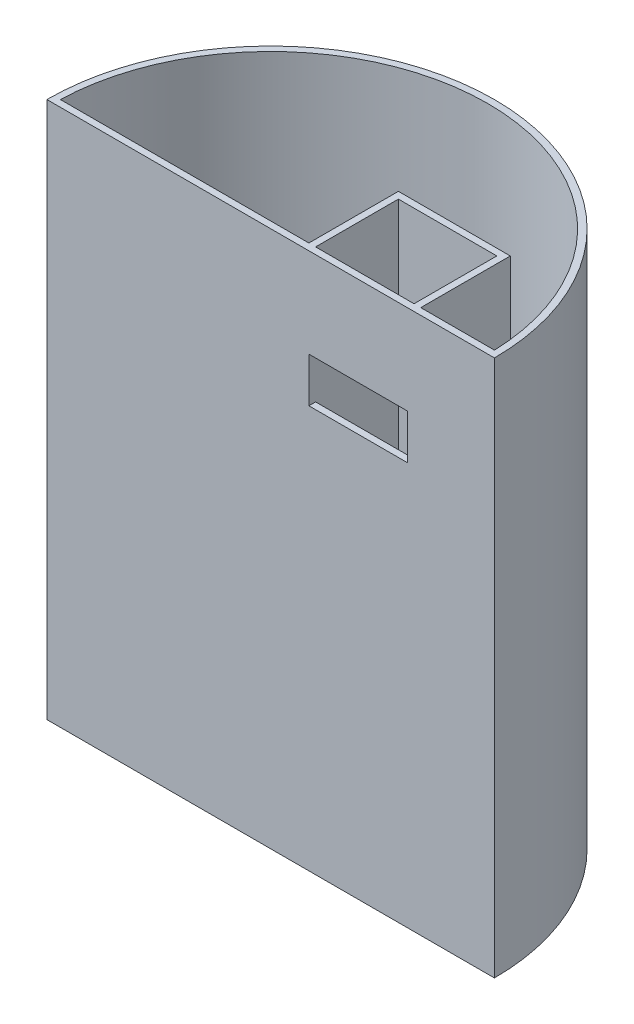
ISO-10303-21;
HEADER;
FILE_DESCRIPTION(('STEP AP214'),'2;1');
FILE_NAME('part.step','',(''),(''),'','','');
FILE_SCHEMA(('AUTOMOTIVE_DESIGN { 1 0 10303 214 1 1 1 1 }'));
ENDSEC;
DATA;
#1=APPLICATION_CONTEXT('core data for automotive mechanical design processes');
#2=APPLICATION_PROTOCOL_DEFINITION('international standard','automotive_design',2000,#1);
#3=PRODUCT_CONTEXT('',#1,'mechanical');
#4=PRODUCT('Part','Part','',(#3));
#5=PRODUCT_RELATED_PRODUCT_CATEGORY('part','',(#4));
#6=PRODUCT_DEFINITION_FORMATION('','',#4);
#7=PRODUCT_DEFINITION_CONTEXT('part definition',#1,'design');
#8=PRODUCT_DEFINITION('design','',#6,#7);
#9=PRODUCT_DEFINITION_SHAPE('','',#8);
#10=(LENGTH_UNIT() NAMED_UNIT(*) SI_UNIT(.MILLI.,.METRE.));
#11=(NAMED_UNIT(*) PLANE_ANGLE_UNIT() SI_UNIT($,.RADIAN.));
#12=(NAMED_UNIT(*) SI_UNIT($,.STERADIAN.) SOLID_ANGLE_UNIT());
#13=UNCERTAINTY_MEASURE_WITH_UNIT(LENGTH_MEASURE(1.E-05),#10,'distance_accuracy_value','');
#14=(GEOMETRIC_REPRESENTATION_CONTEXT(3) GLOBAL_UNCERTAINTY_ASSIGNED_CONTEXT((#13)) GLOBAL_UNIT_ASSIGNED_CONTEXT((#10,
#11,#12)) REPRESENTATION_CONTEXT('',''));
#15=CARTESIAN_POINT('',(0.,0.,0.));
#16=DIRECTION('',(0.,0.,1.));
#17=DIRECTION('',(1.,0.,0.));
#18=AXIS2_PLACEMENT_3D('',#15,#16,#17);
#19=CARTESIAN_POINT('',(161.082312278561,57.,-2.9999999999859));
#20=DIRECTION('',(0.,0.,1.));
#21=DIRECTION('',(1.,0.,0.));
#22=AXIS2_PLACEMENT_3D('',#19,#20,#21);
#23=PLANE('',#22);
#24=DIRECTION('',(0.,1.,0.));
#25=VECTOR('',#24,1.);
#26=CARTESIAN_POINT('',(161.082312278561,57.,-2.9999999999859));
#27=LINE('',#26,#25);
#28=CARTESIAN_POINT('',(161.082312278561,200.,-3.));
#29=VERTEX_POINT('',#28);
#30=CARTESIAN_POINT('',(161.082312278561,240.,-2.9999999999859));
#31=VERTEX_POINT('',#30);
#32=EDGE_CURVE('E190',#29,#31,#27,.T.);
#33=ORIENTED_EDGE('',*,*,#32,.F.);
#34=DIRECTION('',(-1.,0.,0.));
#35=VECTOR('',#34,1.);
#36=CARTESIAN_POINT('',(117.082312278561,200.,-3.));
#37=LINE('',#36,#35);
#38=CARTESIAN_POINT('',(117.082312278561,200.,-3.));
#39=VERTEX_POINT('',#38);
#40=EDGE_CURVE('E163',#29,#39,#37,.T.);
#41=ORIENTED_EDGE('',*,*,#40,.T.);
#42=DIRECTION('',(0.,1.,0.));
#43=VECTOR('',#42,1.);
#44=CARTESIAN_POINT('',(117.082312278561,57.,-2.9999999999859));
#45=LINE('',#44,#43);
#46=CARTESIAN_POINT('',(117.082312278561,240.,-2.9999999999859));
#47=VERTEX_POINT('',#46);
#48=EDGE_CURVE('E176',#39,#47,#45,.T.);
#49=ORIENTED_EDGE('',*,*,#48,.T.);
#50=DIRECTION('',(1.,0.,0.));
#51=VECTOR('',#50,1.);
#52=CARTESIAN_POINT('',(161.082312278561,240.,-2.9999999999859));
#53=LINE('',#52,#51);
#54=EDGE_CURVE('E266',#47,#31,#53,.T.);
#55=ORIENTED_EDGE('',*,*,#54,.T.);
#56=EDGE_LOOP('',(#33,#41,#49,#55));
#57=FACE_BOUND('',#56,.T.);
#58=ADVANCED_FACE('F42',(#57),#23,.F.);
#59=CARTESIAN_POINT('',(-399900.,0.,-2.9999999999859));
#60=DIRECTION('',(0.,0.,-1.));
#61=DIRECTION('',(-1.,0.,0.));
#62=AXIS2_PLACEMENT_3D('',#59,#60,#61);
#63=PLANE('',#62);
#64=DIRECTION('',(-1.,0.,0.));
#65=VECTOR('',#64,1.);
#66=CARTESIAN_POINT('',(164.082312278561,54.,-2.9999999999859));
#67=LINE('',#66,#65);
#68=CARTESIAN_POINT('',(164.082312278561,54.,-2.9999999999859));
#69=VERTEX_POINT('',#68);
#70=CARTESIAN_POINT('',(114.082312278561,54.,-2.9999999999859));
#71=VERTEX_POINT('',#70);
#72=EDGE_CURVE('E178',#69,#71,#67,.T.);
#73=ORIENTED_EDGE('',*,*,#72,.F.);
#74=DIRECTION('',(0.,-1.,0.));
#75=VECTOR('',#74,1.);
#76=CARTESIAN_POINT('',(164.082312278561,240.,-2.9999999999859));
#77=LINE('',#76,#75);
#78=CARTESIAN_POINT('',(164.082312278561,240.,-2.9999999999859));
#79=VERTEX_POINT('',#78);
#80=EDGE_CURVE('E175',#79,#69,#77,.T.);
#81=ORIENTED_EDGE('',*,*,#80,.F.);
#82=DIRECTION('',(-1.,0.,0.));
#83=VECTOR('',#82,1.);
#84=CARTESIAN_POINT('',(-399900.,240.,-2.9999999999859));
#85=LINE('',#84,#83);
#86=CARTESIAN_POINT('',(197.000000000003,240.,-2.9999999999859));
#87=VERTEX_POINT('',#86);
#88=EDGE_CURVE('E222',#87,#79,#85,.T.);
#89=ORIENTED_EDGE('',*,*,#88,.F.);
#90=DIRECTION('',(0.,1.,0.));
#91=VECTOR('',#90,1.);
#92=CARTESIAN_POINT('',(197.000000000003,0.,-2.9999999999859));
#93=LINE('',#92,#91);
#94=CARTESIAN_POINT('',(197.000000000003,3.,-2.9999999999859));
#95=VERTEX_POINT('',#94);
#96=EDGE_CURVE('E226',#95,#87,#93,.T.);
#97=ORIENTED_EDGE('',*,*,#96,.F.);
#98=DIRECTION('',(1.,0.,0.));
#99=VECTOR('',#98,1.);
#100=CARTESIAN_POINT('',(2.9999999999859,3.,-2.9999999999859));
#101=LINE('',#100,#99);
#102=CARTESIAN_POINT('',(2.9999999999859,3.,-2.9999999999859));
#103=VERTEX_POINT('',#102);
#104=EDGE_CURVE('E216',#103,#95,#101,.T.);
#105=ORIENTED_EDGE('',*,*,#104,.F.);
#106=DIRECTION('',(0.,1.,0.));
#107=VECTOR('',#106,1.);
#108=CARTESIAN_POINT('',(2.9999999999859,0.,-2.9999999999859));
#109=LINE('',#108,#107);
#110=CARTESIAN_POINT('',(2.9999999999859,240.,-2.9999999999859));
#111=VERTEX_POINT('',#110);
#112=EDGE_CURVE('E225',#103,#111,#109,.T.);
#113=ORIENTED_EDGE('',*,*,#112,.T.);
#114=CARTESIAN_POINT('',(114.082312278583,240.,-2.9999999999859));
#115=VERTEX_POINT('',#114);
#116=EDGE_CURVE('E221',#115,#111,#85,.T.);
#117=ORIENTED_EDGE('',*,*,#116,.F.);
#118=DIRECTION('',(0.,1.,0.));
#119=VECTOR('',#118,1.);
#120=CARTESIAN_POINT('',(114.082312278561,54.,-2.9999999999859));
#121=LINE('',#120,#119);
#122=EDGE_CURVE('E195',#71,#115,#121,.T.);
#123=ORIENTED_EDGE('',*,*,#122,.F.);
#124=EDGE_LOOP('',(#73,#81,#89,#97,#105,#113,#117,#123));
#125=FACE_BOUND('',#124,.T.);
#126=ADVANCED_FACE('F337',(#125),#63,.T.);
#127=CARTESIAN_POINT('',(100.,0.,0.0686658968005577));
#128=DIRECTION('',(0.,1.,0.));
#129=DIRECTION('',(0.,0.,1.));
#130=AXIS2_PLACEMENT_3D('',#127,#128,#129);
#131=CYLINDRICAL_SURFACE('',#130,97.0485276054521);
#132=CARTESIAN_POINT('',(99.9999999999943,3.,0.0686658968005937));
#133=DIRECTION('',(0.,1.,0.));
#134=DIRECTION('',(0.,0.,-1.));
#135=AXIS2_PLACEMENT_3D('',#132,#133,#134);
#136=CIRCLE('',#135,97.04852760546);
#137=EDGE_CURVE('E214',#95,#103,#136,.T.);
#138=ORIENTED_EDGE('',*,*,#137,.F.);
#139=ORIENTED_EDGE('',*,*,#96,.T.);
#140=CARTESIAN_POINT('',(100.,240.,0.0686658968005577));
#141=DIRECTION('',(0.,1.,0.));
#142=DIRECTION('',(0.,0.,1.));
#143=AXIS2_PLACEMENT_3D('',#140,#141,#142);
#144=CIRCLE('',#143,97.0485276054521);
#145=EDGE_CURVE('E218',#87,#111,#144,.T.);
#146=ORIENTED_EDGE('',*,*,#145,.T.);
#147=ORIENTED_EDGE('',*,*,#112,.F.);
#148=EDGE_LOOP('',(#138,#139,#146,#147));
#149=FACE_BOUND('',#148,.T.);
#150=ADVANCED_FACE('F341',(#149),#131,.F.);
#151=CARTESIAN_POINT('',(100.,240.,0.));
#152=DIRECTION('',(0.,-1.,0.));
#153=DIRECTION('',(0.,0.,-1.));
#154=AXIS2_PLACEMENT_3D('',#151,#152,#153);
#155=CYLINDRICAL_SURFACE('',#154,100.);
#156=CARTESIAN_POINT('',(100.,0.,0.));
#157=DIRECTION('',(0.,1.,0.));
#158=DIRECTION('',(0.,0.,-1.));
#159=AXIS2_PLACEMENT_3D('',#156,#157,#158);
#160=CIRCLE('',#159,100.);
#161=CARTESIAN_POINT('',(200.,0.,0.));
#162=VERTEX_POINT('',#161);
#163=CARTESIAN_POINT('',(0.,0.,0.));
#164=VERTEX_POINT('',#163);
#165=EDGE_CURVE('E228',#162,#164,#160,.T.);
#166=ORIENTED_EDGE('',*,*,#165,.T.);
#167=DIRECTION('',(0.,-1.,0.));
#168=VECTOR('',#167,1.);
#169=CARTESIAN_POINT('',(0.,240.,0.));
#170=LINE('',#169,#168);
#171=CARTESIAN_POINT('',(0.,240.,0.));
#172=VERTEX_POINT('',#171);
#173=EDGE_CURVE('E11',#172,#164,#170,.T.);
#174=ORIENTED_EDGE('',*,*,#173,.F.);
#175=CARTESIAN_POINT('',(100.,240.,0.));
#176=DIRECTION('',(0.,1.,0.));
#177=DIRECTION('',(0.,0.,-1.));
#178=AXIS2_PLACEMENT_3D('',#175,#176,#177);
#179=CIRCLE('',#178,100.);
#180=CARTESIAN_POINT('',(200.,240.,0.));
#181=VERTEX_POINT('',#180);
#182=EDGE_CURVE('E231',#181,#172,#179,.T.);
#183=ORIENTED_EDGE('',*,*,#182,.F.);
#184=DIRECTION('',(0.,-1.,0.));
#185=VECTOR('',#184,1.);
#186=CARTESIAN_POINT('',(200.,240.,0.));
#187=LINE('',#186,#185);
#188=EDGE_CURVE('E51',#181,#162,#187,.T.);
#189=ORIENTED_EDGE('',*,*,#188,.T.);
#190=EDGE_LOOP('',(#166,#174,#183,#189));
#191=FACE_BOUND('',#190,.T.);
#192=ADVANCED_FACE('F44',(#191),#155,.T.);
#193=CARTESIAN_POINT('',(0.,240.,0.));
#194=DIRECTION('',(0.,0.,-1.));
#195=DIRECTION('',(-1.,0.,0.));
#196=AXIS2_PLACEMENT_3D('',#193,#194,#195);
#197=PLANE('',#196);
#198=DIRECTION('',(1.,0.,0.));
#199=VECTOR('',#198,1.);
#200=CARTESIAN_POINT('',(161.082312278561,180.,0.));
#201=LINE('',#200,#199);
#202=CARTESIAN_POINT('',(117.082312278561,180.,0.));
#203=VERTEX_POINT('',#202);
#204=CARTESIAN_POINT('',(161.082312278561,180.,0.));
#205=VERTEX_POINT('',#204);
#206=EDGE_CURVE('E299',#203,#205,#201,.T.);
#207=ORIENTED_EDGE('',*,*,#206,.F.);
#208=DIRECTION('',(0.,-1.,0.));
#209=VECTOR('',#208,1.);
#210=CARTESIAN_POINT('',(117.082312278561,180.,0.));
#211=LINE('',#210,#209);
#212=CARTESIAN_POINT('',(117.082312278561,200.,0.));
#213=VERTEX_POINT('',#212);
#214=EDGE_CURVE('E59',#213,#203,#211,.T.);
#215=ORIENTED_EDGE('',*,*,#214,.F.);
#216=DIRECTION('',(-1.,0.,0.));
#217=VECTOR('',#216,1.);
#218=CARTESIAN_POINT('',(117.082312278561,200.,0.));
#219=LINE('',#218,#217);
#220=CARTESIAN_POINT('',(161.082312278561,200.,0.));
#221=VERTEX_POINT('',#220);
#222=EDGE_CURVE('E170',#221,#213,#219,.T.);
#223=ORIENTED_EDGE('',*,*,#222,.F.);
#224=DIRECTION('',(0.,1.,0.));
#225=VECTOR('',#224,1.);
#226=CARTESIAN_POINT('',(161.082312278561,200.,0.));
#227=LINE('',#226,#225);
#228=EDGE_CURVE('E301',#205,#221,#227,.T.);
#229=ORIENTED_EDGE('',*,*,#228,.F.);
#230=EDGE_LOOP('',(#207,#215,#223,#229));
#231=FACE_BOUND('',#230,.T.);
#232=DIRECTION('',(1.,0.,0.));
#233=VECTOR('',#232,1.);
#234=CARTESIAN_POINT('',(0.,0.,0.));
#235=LINE('',#234,#233);
#236=EDGE_CURVE('E235',#164,#162,#235,.T.);
#237=ORIENTED_EDGE('',*,*,#236,.T.);
#238=ORIENTED_EDGE('',*,*,#188,.F.);
#239=DIRECTION('',(1.,0.,0.));
#240=VECTOR('',#239,1.);
#241=CARTESIAN_POINT('',(0.,240.,0.));
#242=LINE('',#241,#240);
#243=EDGE_CURVE('E234',#172,#181,#242,.T.);
#244=ORIENTED_EDGE('',*,*,#243,.F.);
#245=ORIENTED_EDGE('',*,*,#173,.T.);
#246=EDGE_LOOP('',(#237,#238,#244,#245));
#247=FACE_BOUND('',#246,.T.);
#248=ADVANCED_FACE('F315',(#231,#247),#197,.F.);
#249=CARTESIAN_POINT('',(100.,240.,0.));
#250=DIRECTION('',(0.,-1.,0.));
#251=DIRECTION('',(0.,0.,-1.));
#252=AXIS2_PLACEMENT_3D('',#249,#250,#251);
#253=PLANE('',#252);
#254=ORIENTED_EDGE('',*,*,#54,.F.);
#255=DIRECTION('',(0.,0.,1.));
#256=VECTOR('',#255,1.);
#257=CARTESIAN_POINT('',(117.082312278561,240.,-2.9999999999859));
#258=LINE('',#257,#256);
#259=CARTESIAN_POINT('',(117.082312278561,240.,-39.9999999999859));
#260=VERTEX_POINT('',#259);
#261=EDGE_CURVE('E183',#260,#47,#258,.T.);
#262=ORIENTED_EDGE('',*,*,#261,.F.);
#263=DIRECTION('',(-1.,0.,0.));
#264=VECTOR('',#263,1.);
#265=CARTESIAN_POINT('',(117.082312278561,240.,-39.9999999999859));
#266=LINE('',#265,#264);
#267=CARTESIAN_POINT('',(161.082312278561,240.,-39.9999999999859));
#268=VERTEX_POINT('',#267);
#269=EDGE_CURVE('E279',#268,#260,#266,.T.);
#270=ORIENTED_EDGE('',*,*,#269,.F.);
#271=DIRECTION('',(0.,0.,-1.));
#272=VECTOR('',#271,1.);
#273=CARTESIAN_POINT('',(161.082312278561,240.,-39.9999999999859));
#274=LINE('',#273,#272);
#275=EDGE_CURVE('E277',#31,#268,#274,.T.);
#276=ORIENTED_EDGE('',*,*,#275,.F.);
#277=EDGE_LOOP('',(#254,#262,#270,#276));
#278=FACE_BOUND('',#277,.T.);
#279=ORIENTED_EDGE('',*,*,#88,.T.);
#280=DIRECTION('',(0.,0.,1.));
#281=VECTOR('',#280,1.);
#282=CARTESIAN_POINT('',(164.082312278561,240.,-42.9999999999859));
#283=LINE('',#282,#281);
#284=CARTESIAN_POINT('',(164.082312278561,240.,-42.9999999999859));
#285=VERTEX_POINT('',#284);
#286=EDGE_CURVE('E212',#285,#79,#283,.T.);
#287=ORIENTED_EDGE('',*,*,#286,.F.);
#288=DIRECTION('',(1.,0.,0.));
#289=VECTOR('',#288,1.);
#290=CARTESIAN_POINT('',(164.082312278561,240.,-42.9999999999859));
#291=LINE('',#290,#289);
#292=CARTESIAN_POINT('',(114.082312278561,240.,-42.9999999999859));
#293=VERTEX_POINT('',#292);
#294=EDGE_CURVE('E191',#293,#285,#291,.T.);
#295=ORIENTED_EDGE('',*,*,#294,.F.);
#296=DIRECTION('',(0.,0.,1.));
#297=VECTOR('',#296,1.);
#298=CARTESIAN_POINT('',(114.082312278561,240.,-42.9999999999859));
#299=LINE('',#298,#297);
#300=EDGE_CURVE('E200',#293,#115,#299,.T.);
#301=ORIENTED_EDGE('',*,*,#300,.T.);
#302=ORIENTED_EDGE('',*,*,#116,.T.);
#303=ORIENTED_EDGE('',*,*,#145,.F.);
#304=EDGE_LOOP('',(#279,#287,#295,#301,#302,#303));
#305=FACE_BOUND('',#304,.T.);
#306=ORIENTED_EDGE('',*,*,#182,.T.);
#307=ORIENTED_EDGE('',*,*,#243,.T.);
#308=EDGE_LOOP('',(#306,#307));
#309=FACE_BOUND('',#308,.T.);
#310=ADVANCED_FACE('F289',(#278,#305,#309),#253,.F.);
#311=CARTESIAN_POINT('',(100.,0.,0.));
#312=DIRECTION('',(0.,-1.,0.));
#313=DIRECTION('',(0.,0.,-1.));
#314=AXIS2_PLACEMENT_3D('',#311,#312,#313);
#315=PLANE('',#314);
#316=ORIENTED_EDGE('',*,*,#165,.F.);
#317=ORIENTED_EDGE('',*,*,#236,.F.);
#318=EDGE_LOOP('',(#316,#317));
#319=FACE_BOUND('',#318,.T.);
#320=ADVANCED_FACE('F365',(#319),#315,.T.);
#321=CARTESIAN_POINT('',(99.9999999999943,3.,0.0686658968005937));
#322=DIRECTION('',(0.,-1.,0.));
#323=DIRECTION('',(0.,0.,-1.));
#324=AXIS2_PLACEMENT_3D('',#321,#322,#323);
#325=PLANE('',#324);
#326=ORIENTED_EDGE('',*,*,#137,.T.);
#327=ORIENTED_EDGE('',*,*,#104,.T.);
#328=EDGE_LOOP('',(#326,#327));
#329=FACE_BOUND('',#328,.T.);
#330=ADVANCED_FACE('F362',(#329),#325,.F.);
#331=CARTESIAN_POINT('',(164.082312278561,240.,-42.9999999999859));
#332=DIRECTION('',(-1.,0.,0.));
#333=DIRECTION('',(0.,-1.,0.));
#334=AXIS2_PLACEMENT_3D('',#331,#332,#333);
#335=PLANE('',#334);
#336=ORIENTED_EDGE('',*,*,#80,.T.);
#337=DIRECTION('',(0.,0.,1.));
#338=VECTOR('',#337,1.);
#339=CARTESIAN_POINT('',(164.082312278561,54.,-42.9999999999859));
#340=LINE('',#339,#338);
#341=CARTESIAN_POINT('',(164.082312278561,54.,-42.9999999999859));
#342=VERTEX_POINT('',#341);
#343=EDGE_CURVE('E209',#342,#69,#340,.T.);
#344=ORIENTED_EDGE('',*,*,#343,.F.);
#345=DIRECTION('',(0.,-1.,0.));
#346=VECTOR('',#345,1.);
#347=CARTESIAN_POINT('',(164.082312278561,240.,-42.9999999999859));
#348=LINE('',#347,#346);
#349=EDGE_CURVE('E194',#285,#342,#348,.T.);
#350=ORIENTED_EDGE('',*,*,#349,.F.);
#351=ORIENTED_EDGE('',*,*,#286,.T.);
#352=EDGE_LOOP('',(#336,#344,#350,#351));
#353=FACE_BOUND('',#352,.T.);
#354=ADVANCED_FACE('F358',(#353),#335,.F.);
#355=CARTESIAN_POINT('',(164.082312278561,54.,-42.9999999999859));
#356=DIRECTION('',(0.,1.,0.));
#357=DIRECTION('',(0.,0.,1.));
#358=AXIS2_PLACEMENT_3D('',#355,#356,#357);
#359=PLANE('',#358);
#360=CARTESIAN_POINT('',(144.331422692534,54.,-21.2133618879659));
#361=DIRECTION('',(0.,1.,0.));
#362=DIRECTION('',(0.,0.,1.));
#363=AXIS2_PLACEMENT_3D('',#360,#361,#362);
#364=CIRCLE('',#363,10.);
#365=CARTESIAN_POINT('',(144.331422692534,54.,-11.2133618879659));
#366=VERTEX_POINT('',#365);
#367=EDGE_CURVE('E263',#366,#366,#364,.T.);
#368=ORIENTED_EDGE('',*,*,#367,.T.);
#369=EDGE_LOOP('',(#368));
#370=FACE_BOUND('',#369,.T.);
#371=CARTESIAN_POINT('',(123.835336356765,54.,-21.2133618879659));
#372=DIRECTION('',(0.,1.,0.));
#373=DIRECTION('',(0.,0.,1.));
#374=AXIS2_PLACEMENT_3D('',#371,#372,#373);
#375=CIRCLE('',#374,2.99999999999998);
#376=CARTESIAN_POINT('',(123.835336356765,54.,-18.2133618879659));
#377=VERTEX_POINT('',#376);
#378=EDGE_CURVE('E252',#377,#377,#375,.T.);
#379=ORIENTED_EDGE('',*,*,#378,.T.);
#380=EDGE_LOOP('',(#379));
#381=FACE_BOUND('',#380,.T.);
#382=CARTESIAN_POINT('',(123.835336356765,54.,-10.3230974859317));
#383=DIRECTION('',(0.,1.,0.));
#384=DIRECTION('',(0.,0.,1.));
#385=AXIS2_PLACEMENT_3D('',#382,#383,#384);
#386=CIRCLE('',#385,5.19999999999999);
#387=CARTESIAN_POINT('',(123.835336356765,54.,-5.12309748593166));
#388=VERTEX_POINT('',#387);
#389=EDGE_CURVE('E249',#388,#388,#386,.T.);
#390=ORIENTED_EDGE('',*,*,#389,.T.);
#391=EDGE_LOOP('',(#390));
#392=FACE_BOUND('',#391,.T.);
#393=CARTESIAN_POINT('',(123.835336356765,54.,-33.1653848471031));
#394=DIRECTION('',(0.,1.,0.));
#395=DIRECTION('',(0.,0.,1.));
#396=AXIS2_PLACEMENT_3D('',#393,#394,#395);
#397=CIRCLE('',#396,5.19999999999999);
#398=CARTESIAN_POINT('',(123.835336356765,54.,-27.9653848471032));
#399=VERTEX_POINT('',#398);
#400=EDGE_CURVE('E245',#399,#399,#397,.T.);
#401=ORIENTED_EDGE('',*,*,#400,.T.);
#402=EDGE_LOOP('',(#401));
#403=FACE_BOUND('',#402,.T.);
#404=ORIENTED_EDGE('',*,*,#72,.T.);
#405=DIRECTION('',(0.,0.,1.));
#406=VECTOR('',#405,1.);
#407=CARTESIAN_POINT('',(114.082312278561,54.,-42.9999999999859));
#408=LINE('',#407,#406);
#409=CARTESIAN_POINT('',(114.082312278561,54.,-42.9999999999859));
#410=VERTEX_POINT('',#409);
#411=EDGE_CURVE('E206',#410,#71,#408,.T.);
#412=ORIENTED_EDGE('',*,*,#411,.F.);
#413=DIRECTION('',(-1.,0.,0.));
#414=VECTOR('',#413,1.);
#415=CARTESIAN_POINT('',(164.082312278561,54.,-42.9999999999859));
#416=LINE('',#415,#414);
#417=EDGE_CURVE('E197',#342,#410,#416,.T.);
#418=ORIENTED_EDGE('',*,*,#417,.F.);
#419=ORIENTED_EDGE('',*,*,#343,.T.);
#420=EDGE_LOOP('',(#404,#412,#418,#419));
#421=FACE_BOUND('',#420,.T.);
#422=ADVANCED_FACE('F354',(#370,#381,#392,#403,#421),#359,.F.);
#423=CARTESIAN_POINT('',(114.082312278561,54.,-42.9999999999859));
#424=DIRECTION('',(1.,0.,0.));
#425=DIRECTION('',(0.,0.,-1.));
#426=AXIS2_PLACEMENT_3D('',#423,#424,#425);
#427=PLANE('',#426);
#428=ORIENTED_EDGE('',*,*,#122,.T.);
#429=ORIENTED_EDGE('',*,*,#300,.F.);
#430=DIRECTION('',(0.,1.,0.));
#431=VECTOR('',#430,1.);
#432=CARTESIAN_POINT('',(114.082312278561,54.,-42.9999999999859));
#433=LINE('',#432,#431);
#434=EDGE_CURVE('E199',#410,#293,#433,.T.);
#435=ORIENTED_EDGE('',*,*,#434,.F.);
#436=ORIENTED_EDGE('',*,*,#411,.T.);
#437=EDGE_LOOP('',(#428,#429,#435,#436));
#438=FACE_BOUND('',#437,.T.);
#439=ADVANCED_FACE('F350',(#438),#427,.F.);
#440=CARTESIAN_POINT('',(0.,0.,-42.9999999999859));
#441=DIRECTION('',(0.,0.,-1.));
#442=DIRECTION('',(-1.,0.,0.));
#443=AXIS2_PLACEMENT_3D('',#440,#441,#442);
#444=PLANE('',#443);
#445=ORIENTED_EDGE('',*,*,#294,.T.);
#446=ORIENTED_EDGE('',*,*,#349,.T.);
#447=ORIENTED_EDGE('',*,*,#417,.T.);
#448=ORIENTED_EDGE('',*,*,#434,.T.);
#449=EDGE_LOOP('',(#445,#446,#447,#448));
#450=FACE_BOUND('',#449,.T.);
#451=ADVANCED_FACE('F347',(#450),#444,.T.);
#452=CARTESIAN_POINT('',(117.082312278561,57.,-2.9999999999859));
#453=DIRECTION('',(-1.,0.,0.));
#454=DIRECTION('',(0.,0.,1.));
#455=AXIS2_PLACEMENT_3D('',#452,#453,#454);
#456=PLANE('',#455);
#457=ORIENTED_EDGE('',*,*,#261,.T.);
#458=ORIENTED_EDGE('',*,*,#48,.F.);
#459=DIRECTION('',(0.,0.,1.));
#460=VECTOR('',#459,1.);
#461=CARTESIAN_POINT('',(117.082312278561,200.,-3.));
#462=LINE('',#461,#460);
#463=EDGE_CURVE('E246',#39,#213,#462,.T.);
#464=ORIENTED_EDGE('',*,*,#463,.T.);
#465=ORIENTED_EDGE('',*,*,#214,.T.);
#466=DIRECTION('',(0.,0.,1.));
#467=VECTOR('',#466,1.);
#468=CARTESIAN_POINT('',(117.082312278561,180.,-3.));
#469=LINE('',#468,#467);
#470=CARTESIAN_POINT('',(117.082312278561,180.,-3.));
#471=VERTEX_POINT('',#470);
#472=EDGE_CURVE('E155',#471,#203,#469,.T.);
#473=ORIENTED_EDGE('',*,*,#472,.F.);
#474=CARTESIAN_POINT('',(117.082312278561,57.,-2.9999999999859));
#475=VERTEX_POINT('',#474);
#476=EDGE_CURVE('E160',#475,#471,#45,.T.);
#477=ORIENTED_EDGE('',*,*,#476,.F.);
#478=DIRECTION('',(0.,0.,1.));
#479=VECTOR('',#478,1.);
#480=CARTESIAN_POINT('',(117.082312278561,57.,-2.9999999999859));
#481=LINE('',#480,#479);
#482=CARTESIAN_POINT('',(117.082312278561,57.,-39.9999999999859));
#483=VERTEX_POINT('',#482);
#484=EDGE_CURVE('E273',#483,#475,#481,.T.);
#485=ORIENTED_EDGE('',*,*,#484,.F.);
#486=DIRECTION('',(0.,1.,0.));
#487=VECTOR('',#486,1.);
#488=CARTESIAN_POINT('',(117.082312278561,57.,-39.9999999999859));
#489=LINE('',#488,#487);
#490=EDGE_CURVE('E180',#483,#260,#489,.T.);
#491=ORIENTED_EDGE('',*,*,#490,.T.);
#492=EDGE_LOOP('',(#457,#458,#464,#465,#473,#477,#485,#491));
#493=FACE_BOUND('',#492,.T.);
#494=ADVANCED_FACE('F157',(#493),#456,.F.);
#495=CARTESIAN_POINT('',(117.082312278561,57.,-39.9999999999859));
#496=DIRECTION('',(0.,0.,-1.));
#497=DIRECTION('',(-1.,0.,0.));
#498=AXIS2_PLACEMENT_3D('',#495,#496,#497);
#499=PLANE('',#498);
#500=ORIENTED_EDGE('',*,*,#269,.T.);
#501=ORIENTED_EDGE('',*,*,#490,.F.);
#502=DIRECTION('',(-1.,0.,0.));
#503=VECTOR('',#502,1.);
#504=CARTESIAN_POINT('',(131.082312278561,57.,-39.9999999999859));
#505=LINE('',#504,#503);
#506=CARTESIAN_POINT('',(161.082312278561,57.,-39.9999999999859));
#507=VERTEX_POINT('',#506);
#508=EDGE_CURVE('E271',#507,#483,#505,.T.);
#509=ORIENTED_EDGE('',*,*,#508,.F.);
#510=DIRECTION('',(0.,1.,0.));
#511=VECTOR('',#510,1.);
#512=CARTESIAN_POINT('',(161.082312278561,57.,-39.9999999999859));
#513=LINE('',#512,#511);
#514=EDGE_CURVE('E186',#507,#268,#513,.T.);
#515=ORIENTED_EDGE('',*,*,#514,.T.);
#516=EDGE_LOOP('',(#500,#501,#509,#515));
#517=FACE_BOUND('',#516,.T.);
#518=ADVANCED_FACE('F319',(#517),#499,.F.);
#519=CARTESIAN_POINT('',(161.082312278561,57.,-39.9999999999859));
#520=DIRECTION('',(1.,0.,0.));
#521=DIRECTION('',(0.,0.,-1.));
#522=AXIS2_PLACEMENT_3D('',#519,#520,#521);
#523=PLANE('',#522);
#524=ORIENTED_EDGE('',*,*,#275,.T.);
#525=ORIENTED_EDGE('',*,*,#514,.F.);
#526=DIRECTION('',(0.,0.,-1.));
#527=VECTOR('',#526,1.);
#528=CARTESIAN_POINT('',(161.082312278561,57.,-39.9999999999859));
#529=LINE('',#528,#527);
#530=CARTESIAN_POINT('',(161.082312278561,57.,-2.9999999999859));
#531=VERTEX_POINT('',#530);
#532=EDGE_CURVE('E268',#531,#507,#529,.T.);
#533=ORIENTED_EDGE('',*,*,#532,.F.);
#534=CARTESIAN_POINT('',(161.082312278561,180.,-2.9999999999859));
#535=VERTEX_POINT('',#534);
#536=EDGE_CURVE('E188',#531,#535,#27,.T.);
#537=ORIENTED_EDGE('',*,*,#536,.T.);
#538=DIRECTION('',(0.,0.,1.));
#539=VECTOR('',#538,1.);
#540=CARTESIAN_POINT('',(161.082312278561,180.,-3.));
#541=LINE('',#540,#539);
#542=EDGE_CURVE('E67',#535,#205,#541,.T.);
#543=ORIENTED_EDGE('',*,*,#542,.T.);
#544=ORIENTED_EDGE('',*,*,#228,.T.);
#545=DIRECTION('',(0.,0.,1.));
#546=VECTOR('',#545,1.);
#547=CARTESIAN_POINT('',(161.082312278561,200.,-3.));
#548=LINE('',#547,#546);
#549=EDGE_CURVE('E307',#29,#221,#548,.T.);
#550=ORIENTED_EDGE('',*,*,#549,.F.);
#551=ORIENTED_EDGE('',*,*,#32,.T.);
#552=EDGE_LOOP('',(#524,#525,#533,#537,#543,#544,#550,#551));
#553=FACE_BOUND('',#552,.T.);
#554=ADVANCED_FACE('F310',(#553),#523,.F.);
#555=ORIENTED_EDGE('',*,*,#476,.T.);
#556=DIRECTION('',(1.,0.,0.));
#557=VECTOR('',#556,1.);
#558=CARTESIAN_POINT('',(161.082312278561,180.,-3.));
#559=LINE('',#558,#557);
#560=EDGE_CURVE('E165',#471,#535,#559,.T.);
#561=ORIENTED_EDGE('',*,*,#560,.T.);
#562=ORIENTED_EDGE('',*,*,#536,.F.);
#563=DIRECTION('',(1.,0.,0.));
#564=VECTOR('',#563,1.);
#565=CARTESIAN_POINT('',(128.082312278561,57.,-2.9999999999859));
#566=LINE('',#565,#564);
#567=EDGE_CURVE('E173',#475,#531,#566,.T.);
#568=ORIENTED_EDGE('',*,*,#567,.F.);
#569=EDGE_LOOP('',(#555,#561,#562,#568));
#570=FACE_BOUND('',#569,.T.);
#571=ADVANCED_FACE('F172',(#570),#23,.F.);
#572=CARTESIAN_POINT('',(0.,57.,0.));
#573=DIRECTION('',(0.,-1.,0.));
#574=DIRECTION('',(0.,0.,-1.));
#575=AXIS2_PLACEMENT_3D('',#572,#573,#574);
#576=PLANE('',#575);
#577=CARTESIAN_POINT('',(144.331422692534,57.,-21.2133618879659));
#578=DIRECTION('',(0.,-1.,0.));
#579=DIRECTION('',(0.,0.,-1.));
#580=AXIS2_PLACEMENT_3D('',#577,#578,#579);
#581=CIRCLE('',#580,10.);
#582=CARTESIAN_POINT('',(144.331422692534,57.,-31.2133618879659));
#583=VERTEX_POINT('',#582);
#584=EDGE_CURVE('E46',#583,#583,#581,.T.);
#585=ORIENTED_EDGE('',*,*,#584,.T.);
#586=EDGE_LOOP('',(#585));
#587=FACE_BOUND('',#586,.T.);
#588=CARTESIAN_POINT('',(123.835336356765,57.,-21.2133618879659));
#589=DIRECTION('',(0.,-1.,0.));
#590=DIRECTION('',(0.,0.,-1.));
#591=AXIS2_PLACEMENT_3D('',#588,#589,#590);
#592=CIRCLE('',#591,2.99999999999998);
#593=CARTESIAN_POINT('',(123.835336356765,57.,-24.2133618879659));
#594=VERTEX_POINT('',#593);
#595=EDGE_CURVE('E250',#594,#594,#592,.T.);
#596=ORIENTED_EDGE('',*,*,#595,.T.);
#597=EDGE_LOOP('',(#596));
#598=FACE_BOUND('',#597,.T.);
#599=CARTESIAN_POINT('',(123.835336356765,57.,-10.3230974859317));
#600=DIRECTION('',(0.,-1.,0.));
#601=DIRECTION('',(0.,0.,-1.));
#602=AXIS2_PLACEMENT_3D('',#599,#600,#601);
#603=CIRCLE('',#602,5.19999999999999);
#604=CARTESIAN_POINT('',(123.835336356765,57.,-15.5230974859316));
#605=VERTEX_POINT('',#604);
#606=EDGE_CURVE('E247',#605,#605,#603,.T.);
#607=ORIENTED_EDGE('',*,*,#606,.T.);
#608=EDGE_LOOP('',(#607));
#609=FACE_BOUND('',#608,.T.);
#610=CARTESIAN_POINT('',(123.835336356765,57.,-33.1653848471031));
#611=DIRECTION('',(0.,-1.,0.));
#612=DIRECTION('',(0.,0.,-1.));
#613=AXIS2_PLACEMENT_3D('',#610,#611,#612);
#614=CIRCLE('',#613,5.19999999999999);
#615=CARTESIAN_POINT('',(123.835336356765,57.,-38.3653848471031));
#616=VERTEX_POINT('',#615);
#617=EDGE_CURVE('E242',#616,#616,#614,.T.);
#618=ORIENTED_EDGE('',*,*,#617,.T.);
#619=EDGE_LOOP('',(#618));
#620=FACE_BOUND('',#619,.T.);
#621=ORIENTED_EDGE('',*,*,#567,.T.);
#622=ORIENTED_EDGE('',*,*,#532,.T.);
#623=ORIENTED_EDGE('',*,*,#508,.T.);
#624=ORIENTED_EDGE('',*,*,#484,.T.);
#625=EDGE_LOOP('',(#621,#622,#623,#624));
#626=FACE_BOUND('',#625,.T.);
#627=ADVANCED_FACE('F321',(#587,#598,#609,#620,#626),#576,.F.);
#628=CARTESIAN_POINT('',(123.835336356765,53.,-33.1653848471031));
#629=DIRECTION('',(0.,1.,0.));
#630=DIRECTION('',(0.,0.,1.));
#631=AXIS2_PLACEMENT_3D('',#628,#629,#630);
#632=CYLINDRICAL_SURFACE('',#631,5.19999999999999);
#633=ORIENTED_EDGE('',*,*,#617,.F.);
#634=EDGE_LOOP('',(#633));
#635=FACE_BOUND('',#634,.T.);
#636=ORIENTED_EDGE('',*,*,#400,.F.);
#637=EDGE_LOOP('',(#636));
#638=FACE_BOUND('',#637,.T.);
#639=ADVANCED_FACE('F323',(#635,#638),#632,.F.);
#640=CARTESIAN_POINT('',(123.835336356765,53.,-10.3230974859317));
#641=DIRECTION('',(0.,1.,0.));
#642=DIRECTION('',(0.,0.,1.));
#643=AXIS2_PLACEMENT_3D('',#640,#641,#642);
#644=CYLINDRICAL_SURFACE('',#643,5.19999999999999);
#645=ORIENTED_EDGE('',*,*,#606,.F.);
#646=EDGE_LOOP('',(#645));
#647=FACE_BOUND('',#646,.T.);
#648=ORIENTED_EDGE('',*,*,#389,.F.);
#649=EDGE_LOOP('',(#648));
#650=FACE_BOUND('',#649,.T.);
#651=ADVANCED_FACE('F330',(#647,#650),#644,.F.);
#652=CARTESIAN_POINT('',(123.835336356765,53.,-21.2133618879659));
#653=DIRECTION('',(0.,1.,0.));
#654=DIRECTION('',(0.,0.,1.));
#655=AXIS2_PLACEMENT_3D('',#652,#653,#654);
#656=CYLINDRICAL_SURFACE('',#655,2.99999999999998);
#657=ORIENTED_EDGE('',*,*,#595,.F.);
#658=EDGE_LOOP('',(#657));
#659=FACE_BOUND('',#658,.T.);
#660=ORIENTED_EDGE('',*,*,#378,.F.);
#661=EDGE_LOOP('',(#660));
#662=FACE_BOUND('',#661,.T.);
#663=ADVANCED_FACE('F468',(#659,#662),#656,.F.);
#664=CARTESIAN_POINT('',(144.331422692534,53.,-21.2133618879659));
#665=DIRECTION('',(0.,1.,0.));
#666=DIRECTION('',(0.,0.,1.));
#667=AXIS2_PLACEMENT_3D('',#664,#665,#666);
#668=CYLINDRICAL_SURFACE('',#667,10.);
#669=ORIENTED_EDGE('',*,*,#584,.F.);
#670=EDGE_LOOP('',(#669));
#671=FACE_BOUND('',#670,.T.);
#672=ORIENTED_EDGE('',*,*,#367,.F.);
#673=EDGE_LOOP('',(#672));
#674=FACE_BOUND('',#673,.T.);
#675=ADVANCED_FACE('F479',(#671,#674),#668,.F.);
#676=CARTESIAN_POINT('',(117.082312278561,200.,-3.));
#677=DIRECTION('',(0.,1.,0.));
#678=DIRECTION('',(0.,0.,1.));
#679=AXIS2_PLACEMENT_3D('',#676,#677,#678);
#680=PLANE('',#679);
#681=ORIENTED_EDGE('',*,*,#222,.T.);
#682=ORIENTED_EDGE('',*,*,#463,.F.);
#683=ORIENTED_EDGE('',*,*,#40,.F.);
#684=ORIENTED_EDGE('',*,*,#549,.T.);
#685=EDGE_LOOP('',(#681,#682,#683,#684));
#686=FACE_BOUND('',#685,.T.);
#687=ADVANCED_FACE('F317',(#686),#680,.F.);
#688=CARTESIAN_POINT('',(161.082312278561,180.,-3.));
#689=DIRECTION('',(0.,-1.,0.));
#690=DIRECTION('',(0.,0.,-1.));
#691=AXIS2_PLACEMENT_3D('',#688,#689,#690);
#692=PLANE('',#691);
#693=ORIENTED_EDGE('',*,*,#206,.T.);
#694=ORIENTED_EDGE('',*,*,#542,.F.);
#695=ORIENTED_EDGE('',*,*,#560,.F.);
#696=ORIENTED_EDGE('',*,*,#472,.T.);
#697=EDGE_LOOP('',(#693,#694,#695,#696));
#698=FACE_BOUND('',#697,.T.);
#699=ADVANCED_FACE('F166',(#698),#692,.F.);
#700=CLOSED_SHELL('',(#58,#126,#150,#192,#248,#310,#320,#330,#354,#422,#439,#451,#494,#518,#554,
#571,#627,#639,#651,#663,#675,#687,#699));
#701=MANIFOLD_SOLID_BREP('B2',#700);
#702=ADVANCED_BREP_SHAPE_REPRESENTATION('',(#18,#701),#14);
#703=SHAPE_DEFINITION_REPRESENTATION(#9,#702);
ENDSEC;
END-ISO-10303-21;
